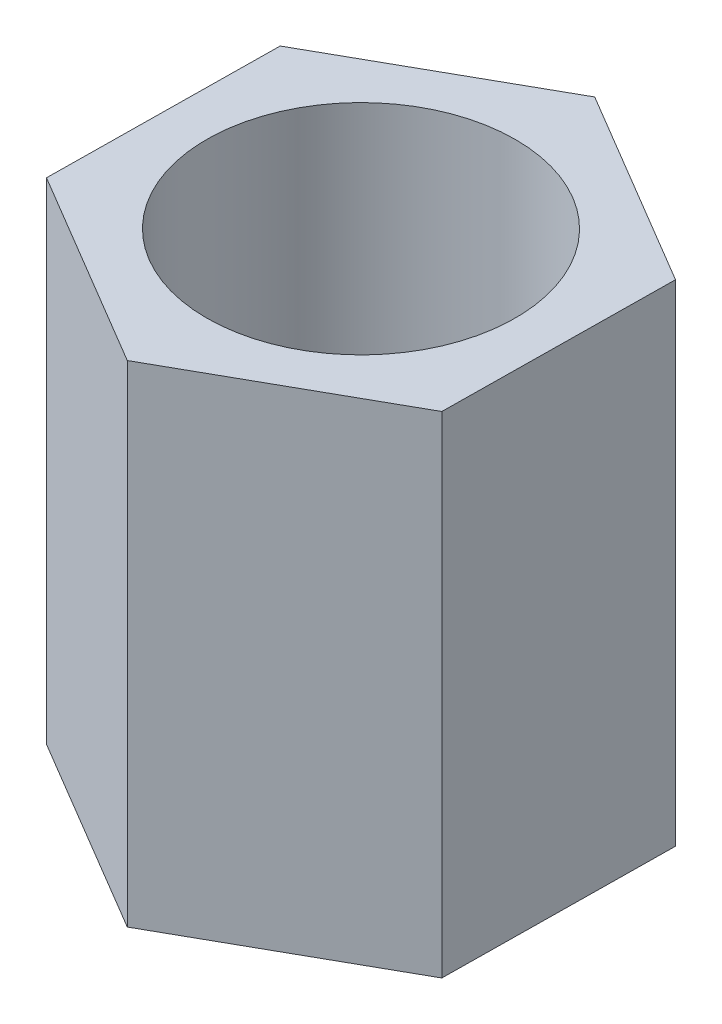
ISO-10303-21;
HEADER;
FILE_DESCRIPTION(('STEP AP214'),'2;1');
FILE_NAME('part.step','',(''),(''),'','','');
FILE_SCHEMA(('AUTOMOTIVE_DESIGN { 1 0 10303 214 1 1 1 1 }'));
ENDSEC;
DATA;
#1=APPLICATION_CONTEXT('core data for automotive mechanical design processes');
#2=APPLICATION_PROTOCOL_DEFINITION('international standard','automotive_design',2000,#1);
#3=PRODUCT_CONTEXT('',#1,'mechanical');
#4=PRODUCT('Part','Part','',(#3));
#5=PRODUCT_RELATED_PRODUCT_CATEGORY('part','',(#4));
#6=PRODUCT_DEFINITION_FORMATION('','',#4);
#7=PRODUCT_DEFINITION_CONTEXT('part definition',#1,'design');
#8=PRODUCT_DEFINITION('design','',#6,#7);
#9=PRODUCT_DEFINITION_SHAPE('','',#8);
#10=(LENGTH_UNIT() NAMED_UNIT(*) SI_UNIT(.MILLI.,.METRE.));
#11=(NAMED_UNIT(*) PLANE_ANGLE_UNIT() SI_UNIT($,.RADIAN.));
#12=(NAMED_UNIT(*) SI_UNIT($,.STERADIAN.) SOLID_ANGLE_UNIT());
#13=UNCERTAINTY_MEASURE_WITH_UNIT(LENGTH_MEASURE(1.E-05),#10,'distance_accuracy_value','');
#14=(GEOMETRIC_REPRESENTATION_CONTEXT(3) GLOBAL_UNCERTAINTY_ASSIGNED_CONTEXT((#13)) GLOBAL_UNIT_ASSIGNED_CONTEXT((#10,
#11,#12)) REPRESENTATION_CONTEXT('',''));
#15=CARTESIAN_POINT('',(0.,0.,0.));
#16=DIRECTION('',(0.,0.,1.));
#17=DIRECTION('',(1.,0.,0.));
#18=AXIS2_PLACEMENT_3D('',#15,#16,#17);
#19=CARTESIAN_POINT('',(0.,5.,0.));
#20=DIRECTION('',(0.,1.,0.));
#21=DIRECTION('',(0.,0.,1.));
#22=AXIS2_PLACEMENT_3D('',#19,#20,#21);
#23=PLANE('',#22);
#24=DIRECTION('',(0.871870864802417,0.,-0.489735842172783));
#25=VECTOR('',#24,1.);
#26=CARTESIAN_POINT('',(-0.0278063959396249,5.,2.3539654645529));
#27=LINE('',#26,#25);
#28=CARTESIAN_POINT('',(-0.0278063959396249,5.,2.3539654645529));
#29=VERTEX_POINT('',#28);
#30=CARTESIAN_POINT('',(2.02469069396424,5.,1.20106377754786));
#31=VERTEX_POINT('',#30);
#32=EDGE_CURVE('E146',#29,#31,#27,.T.);
#33=ORIENTED_EDGE('',*,*,#32,.T.);
#34=DIRECTION('',(0.0118117519358112,0.,-0.999930238824792));
#35=VECTOR('',#34,1.);
#36=CARTESIAN_POINT('',(2.02469069396424,5.,1.20106377754786));
#37=LINE('',#36,#35);
#38=CARTESIAN_POINT('',(2.05249708990386,5.,-1.15290168700505));
#39=VERTEX_POINT('',#38);
#40=EDGE_CURVE('E94',#31,#39,#37,.T.);
#41=ORIENTED_EDGE('',*,*,#40,.T.);
#42=DIRECTION('',(-0.860059112866606,0.,-0.510194396652009));
#43=VECTOR('',#42,1.);
#44=CARTESIAN_POINT('',(2.05249708990386,5.,-1.15290168700505));
#45=LINE('',#44,#43);
#46=CARTESIAN_POINT('',(0.0278063959396257,5.,-2.3539654645529));
#47=VERTEX_POINT('',#46);
#48=EDGE_CURVE('E107',#39,#47,#45,.T.);
#49=ORIENTED_EDGE('',*,*,#48,.T.);
#50=DIRECTION('',(-0.871870864802417,0.,0.489735842172783));
#51=VECTOR('',#50,1.);
#52=CARTESIAN_POINT('',(0.0278063959396257,5.,-2.3539654645529));
#53=LINE('',#52,#51);
#54=CARTESIAN_POINT('',(-2.02469069396424,5.,-1.20106377754786));
#55=VERTEX_POINT('',#54);
#56=EDGE_CURVE('E101',#47,#55,#53,.T.);
#57=ORIENTED_EDGE('',*,*,#56,.T.);
#58=DIRECTION('',(-0.0118117519358117,0.,0.999930238824793));
#59=VECTOR('',#58,1.);
#60=CARTESIAN_POINT('',(-2.02469069396424,5.,-1.20106377754786));
#61=LINE('',#60,#59);
#62=CARTESIAN_POINT('',(-2.05249708990386,5.,1.15290168700505));
#63=VERTEX_POINT('',#62);
#64=EDGE_CURVE('E105',#55,#63,#61,.T.);
#65=ORIENTED_EDGE('',*,*,#64,.T.);
#66=DIRECTION('',(0.860059112866606,0.,0.510194396652009));
#67=VECTOR('',#66,1.);
#68=CARTESIAN_POINT('',(-2.05249708990386,5.,1.15290168700505));
#69=LINE('',#68,#67);
#70=EDGE_CURVE('E57',#63,#29,#69,.T.);
#71=ORIENTED_EDGE('',*,*,#70,.T.);
#72=EDGE_LOOP('',(#33,#41,#49,#57,#65,#71));
#73=FACE_BOUND('',#72,.T.);
#74=CARTESIAN_POINT('',(0.,5.,0.));
#75=DIRECTION('',(0.,1.,0.));
#76=DIRECTION('',(0.,0.,1.));
#77=AXIS2_PLACEMENT_3D('',#74,#75,#76);
#78=CIRCLE('',#77,1.575);
#79=CARTESIAN_POINT('',(0.,5.,1.575));
#80=VERTEX_POINT('',#79);
#81=EDGE_CURVE('E134',#80,#80,#78,.T.);
#82=ORIENTED_EDGE('',*,*,#81,.F.);
#83=EDGE_LOOP('',(#82));
#84=FACE_BOUND('',#83,.T.);
#85=ADVANCED_FACE('F39',(#73,#84),#23,.T.);
#86=CARTESIAN_POINT('',(0.,0.,0.));
#87=DIRECTION('',(0.,1.,0.));
#88=DIRECTION('',(0.,0.,1.));
#89=AXIS2_PLACEMENT_3D('',#86,#87,#88);
#90=PLANE('',#89);
#91=DIRECTION('',(0.871870864802417,0.,-0.489735842172783));
#92=VECTOR('',#91,1.);
#93=CARTESIAN_POINT('',(-0.0278063959396249,0.,2.3539654645529));
#94=LINE('',#93,#92);
#95=CARTESIAN_POINT('',(-0.0278063959396249,0.,2.3539654645529));
#96=VERTEX_POINT('',#95);
#97=CARTESIAN_POINT('',(2.02469069396424,0.,1.20106377754786));
#98=VERTEX_POINT('',#97);
#99=EDGE_CURVE('E129',#96,#98,#94,.T.);
#100=ORIENTED_EDGE('',*,*,#99,.F.);
#101=DIRECTION('',(0.860059112866606,0.,0.510194396652009));
#102=VECTOR('',#101,1.);
#103=CARTESIAN_POINT('',(-2.05249708990386,0.,1.15290168700505));
#104=LINE('',#103,#102);
#105=CARTESIAN_POINT('',(-2.05249708990386,0.,1.15290168700505));
#106=VERTEX_POINT('',#105);
#107=EDGE_CURVE('E86',#106,#96,#104,.T.);
#108=ORIENTED_EDGE('',*,*,#107,.F.);
#109=DIRECTION('',(-0.0118117519358117,0.,0.999930238824793));
#110=VECTOR('',#109,1.);
#111=CARTESIAN_POINT('',(-2.02469069396424,0.,-1.20106377754786));
#112=LINE('',#111,#110);
#113=CARTESIAN_POINT('',(-2.02469069396424,0.,-1.20106377754786));
#114=VERTEX_POINT('',#113);
#115=EDGE_CURVE('E80',#114,#106,#112,.T.);
#116=ORIENTED_EDGE('',*,*,#115,.F.);
#117=DIRECTION('',(-0.871870864802417,0.,0.489735842172783));
#118=VECTOR('',#117,1.);
#119=CARTESIAN_POINT('',(0.0278063959396257,0.,-2.3539654645529));
#120=LINE('',#119,#118);
#121=CARTESIAN_POINT('',(0.0278063959396257,0.,-2.3539654645529));
#122=VERTEX_POINT('',#121);
#123=EDGE_CURVE('E116',#122,#114,#120,.T.);
#124=ORIENTED_EDGE('',*,*,#123,.F.);
#125=DIRECTION('',(-0.860059112866606,0.,-0.510194396652009));
#126=VECTOR('',#125,1.);
#127=CARTESIAN_POINT('',(2.05249708990386,0.,-1.15290168700505));
#128=LINE('',#127,#126);
#129=CARTESIAN_POINT('',(2.05249708990386,0.,-1.15290168700505));
#130=VERTEX_POINT('',#129);
#131=EDGE_CURVE('E137',#130,#122,#128,.T.);
#132=ORIENTED_EDGE('',*,*,#131,.F.);
#133=DIRECTION('',(0.0118117519358112,0.,-0.999930238824792));
#134=VECTOR('',#133,1.);
#135=CARTESIAN_POINT('',(2.02469069396424,0.,1.20106377754786));
#136=LINE('',#135,#134);
#137=EDGE_CURVE('E133',#98,#130,#136,.T.);
#138=ORIENTED_EDGE('',*,*,#137,.F.);
#139=EDGE_LOOP('',(#100,#108,#116,#124,#132,#138));
#140=FACE_BOUND('',#139,.T.);
#141=CARTESIAN_POINT('',(0.,0.,0.));
#142=DIRECTION('',(0.,1.,0.));
#143=DIRECTION('',(0.,0.,1.));
#144=AXIS2_PLACEMENT_3D('',#141,#142,#143);
#145=CIRCLE('',#144,1.575);
#146=CARTESIAN_POINT('',(0.,0.,1.575));
#147=VERTEX_POINT('',#146);
#148=EDGE_CURVE('E243',#147,#147,#145,.T.);
#149=ORIENTED_EDGE('',*,*,#148,.T.);
#150=EDGE_LOOP('',(#149));
#151=FACE_BOUND('',#150,.T.);
#152=ADVANCED_FACE('F159',(#140,#151),#90,.F.);
#153=CARTESIAN_POINT('',(-0.0278063959396249,5.,2.3539654645529));
#154=DIRECTION('',(-0.489735842172783,0.,-0.871870864802417));
#155=DIRECTION('',(-0.871870864802417,0.,0.489735842172783));
#156=AXIS2_PLACEMENT_3D('',#153,#154,#155);
#157=PLANE('',#156);
#158=ORIENTED_EDGE('',*,*,#99,.T.);
#159=DIRECTION('',(0.,-1.,0.));
#160=VECTOR('',#159,1.);
#161=CARTESIAN_POINT('',(2.02469069396424,5.,1.20106377754786));
#162=LINE('',#161,#160);
#163=EDGE_CURVE('E11',#31,#98,#162,.T.);
#164=ORIENTED_EDGE('',*,*,#163,.F.);
#165=ORIENTED_EDGE('',*,*,#32,.F.);
#166=DIRECTION('',(0.,-1.,0.));
#167=VECTOR('',#166,1.);
#168=CARTESIAN_POINT('',(-0.0278063959396249,5.,2.3539654645529));
#169=LINE('',#168,#167);
#170=EDGE_CURVE('E125',#29,#96,#169,.T.);
#171=ORIENTED_EDGE('',*,*,#170,.T.);
#172=EDGE_LOOP('',(#158,#164,#165,#171));
#173=FACE_BOUND('',#172,.T.);
#174=ADVANCED_FACE('F41',(#173),#157,.F.);
#175=CARTESIAN_POINT('',(2.02469069396424,5.,1.20106377754786));
#176=DIRECTION('',(-0.999930238824793,0.,-0.0118117519358112));
#177=DIRECTION('',(-0.0118117519358112,0.,0.999930238824793));
#178=AXIS2_PLACEMENT_3D('',#175,#176,#177);
#179=PLANE('',#178);
#180=ORIENTED_EDGE('',*,*,#137,.T.);
#181=DIRECTION('',(0.,-1.,0.));
#182=VECTOR('',#181,1.);
#183=CARTESIAN_POINT('',(2.05249708990386,5.,-1.15290168700505));
#184=LINE('',#183,#182);
#185=EDGE_CURVE('E49',#39,#130,#184,.T.);
#186=ORIENTED_EDGE('',*,*,#185,.F.);
#187=ORIENTED_EDGE('',*,*,#40,.F.);
#188=ORIENTED_EDGE('',*,*,#163,.T.);
#189=EDGE_LOOP('',(#180,#186,#187,#188));
#190=FACE_BOUND('',#189,.T.);
#191=ADVANCED_FACE('F184',(#190),#179,.F.);
#192=CARTESIAN_POINT('',(2.05249708990386,5.,-1.15290168700505));
#193=DIRECTION('',(-0.510194396652009,0.,0.860059112866606));
#194=DIRECTION('',(0.860059112866606,0.,0.510194396652009));
#195=AXIS2_PLACEMENT_3D('',#192,#193,#194);
#196=PLANE('',#195);
#197=ORIENTED_EDGE('',*,*,#131,.T.);
#198=DIRECTION('',(0.,-1.,0.));
#199=VECTOR('',#198,1.);
#200=CARTESIAN_POINT('',(0.0278063959396257,5.,-2.3539654645529));
#201=LINE('',#200,#199);
#202=EDGE_CURVE('E118',#47,#122,#201,.T.);
#203=ORIENTED_EDGE('',*,*,#202,.F.);
#204=ORIENTED_EDGE('',*,*,#48,.F.);
#205=ORIENTED_EDGE('',*,*,#185,.T.);
#206=EDGE_LOOP('',(#197,#203,#204,#205));
#207=FACE_BOUND('',#206,.T.);
#208=ADVANCED_FACE('F156',(#207),#196,.F.);
#209=CARTESIAN_POINT('',(0.0278063959396257,5.,-2.3539654645529));
#210=DIRECTION('',(0.489735842172783,0.,0.871870864802417));
#211=DIRECTION('',(0.871870864802417,0.,-0.489735842172784));
#212=AXIS2_PLACEMENT_3D('',#209,#210,#211);
#213=PLANE('',#212);
#214=ORIENTED_EDGE('',*,*,#123,.T.);
#215=DIRECTION('',(0.,-1.,0.));
#216=VECTOR('',#215,1.);
#217=CARTESIAN_POINT('',(-2.02469069396424,5.,-1.20106377754786));
#218=LINE('',#217,#216);
#219=EDGE_CURVE('E113',#55,#114,#218,.T.);
#220=ORIENTED_EDGE('',*,*,#219,.F.);
#221=ORIENTED_EDGE('',*,*,#56,.F.);
#222=ORIENTED_EDGE('',*,*,#202,.T.);
#223=EDGE_LOOP('',(#214,#220,#221,#222));
#224=FACE_BOUND('',#223,.T.);
#225=ADVANCED_FACE('F114',(#224),#213,.F.);
#226=CARTESIAN_POINT('',(-2.02469069396424,5.,-1.20106377754786));
#227=DIRECTION('',(0.999930238824793,0.,0.0118117519358117));
#228=DIRECTION('',(0.0118117519358117,0.,-0.999930238824793));
#229=AXIS2_PLACEMENT_3D('',#226,#227,#228);
#230=PLANE('',#229);
#231=ORIENTED_EDGE('',*,*,#115,.T.);
#232=DIRECTION('',(0.,-1.,0.));
#233=VECTOR('',#232,1.);
#234=CARTESIAN_POINT('',(-2.05249708990386,5.,1.15290168700505));
#235=LINE('',#234,#233);
#236=EDGE_CURVE('E119',#63,#106,#235,.T.);
#237=ORIENTED_EDGE('',*,*,#236,.F.);
#238=ORIENTED_EDGE('',*,*,#64,.F.);
#239=ORIENTED_EDGE('',*,*,#219,.T.);
#240=EDGE_LOOP('',(#231,#237,#238,#239));
#241=FACE_BOUND('',#240,.T.);
#242=ADVANCED_FACE('F121',(#241),#230,.F.);
#243=CARTESIAN_POINT('',(-2.05249708990386,5.,1.15290168700505));
#244=DIRECTION('',(0.510194396652009,0.,-0.860059112866606));
#245=DIRECTION('',(-0.860059112866606,0.,-0.510194396652009));
#246=AXIS2_PLACEMENT_3D('',#243,#244,#245);
#247=PLANE('',#246);
#248=ORIENTED_EDGE('',*,*,#107,.T.);
#249=ORIENTED_EDGE('',*,*,#170,.F.);
#250=ORIENTED_EDGE('',*,*,#70,.F.);
#251=ORIENTED_EDGE('',*,*,#236,.T.);
#252=EDGE_LOOP('',(#248,#249,#250,#251));
#253=FACE_BOUND('',#252,.T.);
#254=ADVANCED_FACE('F164',(#253),#247,.F.);
#255=CARTESIAN_POINT('',(0.,5.,0.));
#256=DIRECTION('',(0.,-1.,0.));
#257=DIRECTION('',(0.,0.,-1.));
#258=AXIS2_PLACEMENT_3D('',#255,#256,#257);
#259=CYLINDRICAL_SURFACE('',#258,1.575);
#260=ORIENTED_EDGE('',*,*,#81,.T.);
#261=EDGE_LOOP('',(#260));
#262=FACE_BOUND('',#261,.T.);
#263=ORIENTED_EDGE('',*,*,#148,.F.);
#264=EDGE_LOOP('',(#263));
#265=FACE_BOUND('',#264,.T.);
#266=ADVANCED_FACE('F166',(#262,#265),#259,.F.);
#267=CLOSED_SHELL('',(#85,#152,#174,#191,#208,#225,#242,#254,#266));
#268=MANIFOLD_SOLID_BREP('B2',#267);
#269=ADVANCED_BREP_SHAPE_REPRESENTATION('',(#18,#268),#14);
#270=SHAPE_DEFINITION_REPRESENTATION(#9,#269);
ENDSEC;
END-ISO-10303-21;
